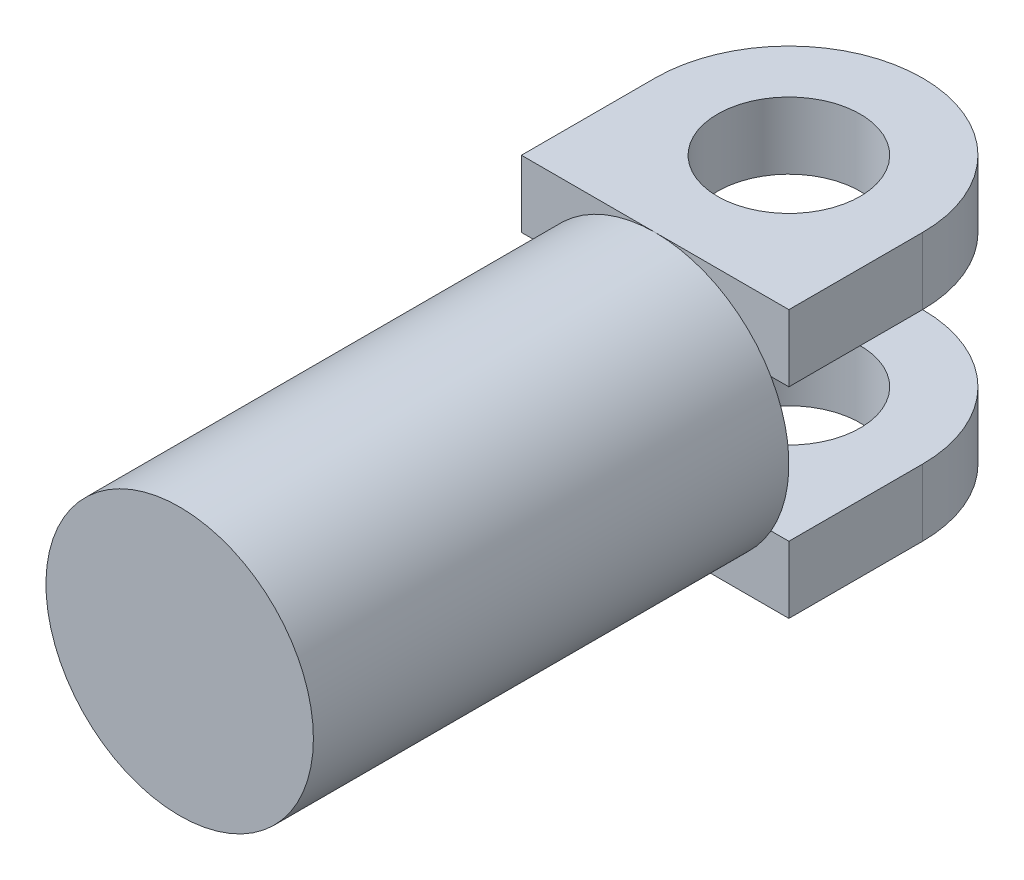
ISO-10303-21;
HEADER;
FILE_DESCRIPTION(('STEP AP214'),'2;1');
FILE_NAME('part.step','',(''),(''),'','','');
FILE_SCHEMA(('AUTOMOTIVE_DESIGN { 1 0 10303 214 1 1 1 1 }'));
ENDSEC;
DATA;
#1=APPLICATION_CONTEXT('core data for automotive mechanical design processes');
#2=APPLICATION_PROTOCOL_DEFINITION('international standard','automotive_design',2000,#1);
#3=PRODUCT_CONTEXT('',#1,'mechanical');
#4=PRODUCT('Part','Part','',(#3));
#5=PRODUCT_RELATED_PRODUCT_CATEGORY('part','',(#4));
#6=PRODUCT_DEFINITION_FORMATION('','',#4);
#7=PRODUCT_DEFINITION_CONTEXT('part definition',#1,'design');
#8=PRODUCT_DEFINITION('design','',#6,#7);
#9=PRODUCT_DEFINITION_SHAPE('','',#8);
#10=(LENGTH_UNIT() NAMED_UNIT(*) SI_UNIT(.MILLI.,.METRE.));
#11=(NAMED_UNIT(*) PLANE_ANGLE_UNIT() SI_UNIT($,.RADIAN.));
#12=(NAMED_UNIT(*) SI_UNIT($,.STERADIAN.) SOLID_ANGLE_UNIT());
#13=UNCERTAINTY_MEASURE_WITH_UNIT(LENGTH_MEASURE(1.E-05),#10,'distance_accuracy_value','');
#14=(GEOMETRIC_REPRESENTATION_CONTEXT(3) GLOBAL_UNCERTAINTY_ASSIGNED_CONTEXT((#13)) GLOBAL_UNIT_ASSIGNED_CONTEXT((#10,
#11,#12)) REPRESENTATION_CONTEXT('',''));
#15=CARTESIAN_POINT('',(0.,0.,0.));
#16=DIRECTION('',(0.,0.,1.));
#17=DIRECTION('',(1.,0.,0.));
#18=AXIS2_PLACEMENT_3D('',#15,#16,#17);
#19=CARTESIAN_POINT('',(0.,-90.,-90.));
#20=DIRECTION('',(0.,1.,0.));
#21=DIRECTION('',(0.,0.,1.));
#22=AXIS2_PLACEMENT_3D('',#19,#20,#21);
#23=CYLINDRICAL_SURFACE('',#22,90.);
#24=CARTESIAN_POINT('',(0.,-45.,-90.));
#25=DIRECTION('',(0.,-1.,0.));
#26=DIRECTION('',(0.,0.,-1.));
#27=AXIS2_PLACEMENT_3D('',#24,#25,#26);
#28=CIRCLE('',#27,90.);
#29=CARTESIAN_POINT('',(90.,-45.,-90.));
#30=VERTEX_POINT('',#29);
#31=CARTESIAN_POINT('',(-90.,-45.,-90.));
#32=VERTEX_POINT('',#31);
#33=EDGE_CURVE('E133',#30,#32,#28,.F.);
#34=ORIENTED_EDGE('',*,*,#33,.F.);
#35=DIRECTION('',(0.,1.,0.));
#36=VECTOR('',#35,1.);
#37=CARTESIAN_POINT('',(90.,-90.,-90.));
#38=LINE('',#37,#36);
#39=CARTESIAN_POINT('',(90.,-90.,-90.));
#40=VERTEX_POINT('',#39);
#41=EDGE_CURVE('E181',#40,#30,#38,.T.);
#42=ORIENTED_EDGE('',*,*,#41,.F.);
#43=CARTESIAN_POINT('',(0.,-90.,-90.));
#44=DIRECTION('',(0.,1.,0.));
#45=DIRECTION('',(0.,0.,1.));
#46=AXIS2_PLACEMENT_3D('',#43,#44,#45);
#47=CIRCLE('',#46,90.);
#48=CARTESIAN_POINT('',(-90.,-90.,-90.));
#49=VERTEX_POINT('',#48);
#50=EDGE_CURVE('E200',#40,#49,#47,.T.);
#51=ORIENTED_EDGE('',*,*,#50,.T.);
#52=DIRECTION('',(0.,1.,0.));
#53=VECTOR('',#52,1.);
#54=CARTESIAN_POINT('',(-90.,-90.,-90.));
#55=LINE('',#54,#53);
#56=EDGE_CURVE('E159',#49,#32,#55,.T.);
#57=ORIENTED_EDGE('',*,*,#56,.T.);
#58=EDGE_LOOP('',(#34,#42,#51,#57));
#59=FACE_BOUND('',#58,.T.);
#60=ADVANCED_FACE('F41',(#59),#23,.T.);
#61=CARTESIAN_POINT('',(90.,-90.,0.));
#62=DIRECTION('',(1.,0.,0.));
#63=DIRECTION('',(0.,0.,-1.));
#64=AXIS2_PLACEMENT_3D('',#61,#62,#63);
#65=PLANE('',#64);
#66=DIRECTION('',(0.,0.,-1.));
#67=VECTOR('',#66,1.);
#68=CARTESIAN_POINT('',(90.,-45.,0.));
#69=LINE('',#68,#67);
#70=CARTESIAN_POINT('',(90.,-45.,0.));
#71=VERTEX_POINT('',#70);
#72=EDGE_CURVE('E231',#71,#30,#69,.T.);
#73=ORIENTED_EDGE('',*,*,#72,.F.);
#74=DIRECTION('',(0.,1.,0.));
#75=VECTOR('',#74,1.);
#76=CARTESIAN_POINT('',(90.,-90.,0.));
#77=LINE('',#76,#75);
#78=CARTESIAN_POINT('',(90.,-90.,0.));
#79=VERTEX_POINT('',#78);
#80=EDGE_CURVE('E157',#79,#71,#77,.T.);
#81=ORIENTED_EDGE('',*,*,#80,.F.);
#82=DIRECTION('',(0.,0.,-1.));
#83=VECTOR('',#82,1.);
#84=CARTESIAN_POINT('',(90.,-90.,0.));
#85=LINE('',#84,#83);
#86=EDGE_CURVE('E190',#79,#40,#85,.T.);
#87=ORIENTED_EDGE('',*,*,#86,.T.);
#88=ORIENTED_EDGE('',*,*,#41,.T.);
#89=EDGE_LOOP('',(#73,#81,#87,#88));
#90=FACE_BOUND('',#89,.T.);
#91=ADVANCED_FACE('F303',(#90),#65,.T.);
#92=CARTESIAN_POINT('',(0.,-90.,-90.));
#93=DIRECTION('',(0.,1.,0.));
#94=DIRECTION('',(0.,0.,1.));
#95=AXIS2_PLACEMENT_3D('',#92,#93,#94);
#96=CYLINDRICAL_SURFACE('',#95,48.);
#97=CARTESIAN_POINT('',(0.,-45.,-90.));
#98=DIRECTION('',(0.,-1.,0.));
#99=DIRECTION('',(0.,0.,-1.));
#100=AXIS2_PLACEMENT_3D('',#97,#98,#99);
#101=CIRCLE('',#100,48.);
#102=CARTESIAN_POINT('',(0.,-45.,-42.));
#103=VERTEX_POINT('',#102);
#104=EDGE_CURVE('E234',#103,#103,#101,.F.);
#105=CARTESIAN_POINT('',(0.,-90.,-90.));
#106=DIRECTION('',(0.,1.,0.));
#107=DIRECTION('',(0.,0.,1.));
#108=AXIS2_PLACEMENT_3D('',#105,#106,#107);
#109=CIRCLE('',#108,48.);
#110=CARTESIAN_POINT('',(0.,-90.,-42.));
#111=VERTEX_POINT('',#110);
#112=EDGE_CURVE('E204',#111,#111,#109,.T.);
#113=CARTESIAN_POINT('',(0.,-45.,-42.));
#114=CARTESIAN_POINT('',(0.,-45.46875,-42.));
#115=CARTESIAN_POINT('',(0.,-45.9375,-42.));
#116=CARTESIAN_POINT('',(0.,-46.875,-42.));
#117=CARTESIAN_POINT('',(0.,-47.34375,-42.));
#118=CARTESIAN_POINT('',(0.,-48.28125,-42.));
#119=CARTESIAN_POINT('',(0.,-48.75,-42.));
#120=CARTESIAN_POINT('',(0.,-49.6875,-42.));
#121=CARTESIAN_POINT('',(0.,-50.15625,-42.));
#122=CARTESIAN_POINT('',(0.,-51.09375,-42.));
#123=CARTESIAN_POINT('',(0.,-51.5625,-42.));
#124=CARTESIAN_POINT('',(0.,-52.5,-42.));
#125=CARTESIAN_POINT('',(0.,-52.96875,-42.));
#126=CARTESIAN_POINT('',(0.,-53.90625,-42.));
#127=CARTESIAN_POINT('',(0.,-54.375,-42.));
#128=CARTESIAN_POINT('',(0.,-55.3125,-42.));
#129=CARTESIAN_POINT('',(0.,-55.78125,-42.));
#130=CARTESIAN_POINT('',(0.,-56.71875,-42.));
#131=CARTESIAN_POINT('',(0.,-57.1875,-42.));
#132=CARTESIAN_POINT('',(0.,-58.125,-42.));
#133=CARTESIAN_POINT('',(0.,-58.59375,-42.));
#134=CARTESIAN_POINT('',(0.,-59.53125,-42.));
#135=CARTESIAN_POINT('',(0.,-60.,-42.));
#136=CARTESIAN_POINT('',(0.,-60.9375,-42.));
#137=CARTESIAN_POINT('',(0.,-61.40625,-42.));
#138=CARTESIAN_POINT('',(0.,-62.34375,-42.));
#139=CARTESIAN_POINT('',(0.,-62.8125,-42.));
#140=CARTESIAN_POINT('',(0.,-63.75,-42.));
#141=CARTESIAN_POINT('',(0.,-64.21875,-42.));
#142=CARTESIAN_POINT('',(0.,-65.15625,-42.));
#143=CARTESIAN_POINT('',(0.,-65.625,-42.));
#144=CARTESIAN_POINT('',(0.,-66.5625,-42.));
#145=CARTESIAN_POINT('',(0.,-67.03125,-42.));
#146=CARTESIAN_POINT('',(0.,-67.96875,-42.));
#147=CARTESIAN_POINT('',(0.,-68.4375,-42.));
#148=CARTESIAN_POINT('',(0.,-69.375,-42.));
#149=CARTESIAN_POINT('',(0.,-69.84375,-42.));
#150=CARTESIAN_POINT('',(0.,-70.78125,-42.));
#151=CARTESIAN_POINT('',(0.,-71.25,-42.));
#152=CARTESIAN_POINT('',(0.,-72.1875,-42.));
#153=CARTESIAN_POINT('',(0.,-72.65625,-42.));
#154=CARTESIAN_POINT('',(0.,-73.59375,-42.));
#155=CARTESIAN_POINT('',(0.,-74.0625,-42.));
#156=CARTESIAN_POINT('',(0.,-75.,-42.));
#157=CARTESIAN_POINT('',(0.,-75.46875,-42.));
#158=CARTESIAN_POINT('',(0.,-76.40625,-42.));
#159=CARTESIAN_POINT('',(0.,-76.875,-42.));
#160=CARTESIAN_POINT('',(0.,-77.8125,-42.));
#161=CARTESIAN_POINT('',(0.,-78.28125,-42.));
#162=CARTESIAN_POINT('',(0.,-79.21875,-42.));
#163=CARTESIAN_POINT('',(0.,-79.6875,-42.));
#164=CARTESIAN_POINT('',(0.,-80.625,-42.));
#165=CARTESIAN_POINT('',(0.,-81.09375,-42.));
#166=CARTESIAN_POINT('',(0.,-82.03125,-42.));
#167=CARTESIAN_POINT('',(0.,-82.5,-42.));
#168=CARTESIAN_POINT('',(0.,-83.4375,-42.));
#169=CARTESIAN_POINT('',(0.,-83.90625,-42.));
#170=CARTESIAN_POINT('',(0.,-84.84375,-42.));
#171=CARTESIAN_POINT('',(0.,-85.3125,-42.));
#172=CARTESIAN_POINT('',(0.,-86.25,-42.));
#173=CARTESIAN_POINT('',(0.,-86.71875,-42.));
#174=CARTESIAN_POINT('',(0.,-87.65625,-42.));
#175=CARTESIAN_POINT('',(0.,-88.125,-42.));
#176=CARTESIAN_POINT('',(0.,-89.0625,-42.));
#177=CARTESIAN_POINT('',(0.,-89.53125,-42.));
#178=CARTESIAN_POINT('',(0.,-90.,-42.));
#179=B_SPLINE_CURVE_WITH_KNOTS('',3,(#113,#114,#115,#116,#117,#118,#119,#120,#121,#122,#123,
#124,#125,#126,#127,#128,#129,#130,#131,#132,#133,#134,#135,#136,#137,#138,#139,#140,#141,#142,
#143,#144,#145,#146,#147,#148,#149,#150,#151,#152,#153,#154,#155,#156,#157,#158,#159,#160,#161,
#162,#163,#164,#165,#166,#167,#168,#169,#170,#171,#172,#173,#174,#175,#176,#177,#178),
.UNSPECIFIED.,.F.,.F.,(4,2,2,2,2,2,2,2,2,2,2,2,2,2,2,2,2,2,2,2,2,2,2,2,2,2,2,2,2,2,2,2,4),(0.,
1.40625,2.8125,4.21875,5.625,7.03125,8.4375,9.84375,11.25,12.65625,14.0625,15.46875,16.875,
18.28125,19.6875,21.09375,22.5,23.90625,25.3125,26.71875,28.125,29.53125,30.9375,32.34375,33.75,
35.15625,36.5625,37.96875,39.375,40.78125,42.1875,43.59375,45.),.UNSPECIFIED.);
#180=EDGE_CURVE('BSEAM299',#103,#111,#179,.T.);
#181=ORIENTED_EDGE('',*,*,#104,.T.);
#182=ORIENTED_EDGE('',*,*,#112,.F.);
#183=ORIENTED_EDGE('',*,*,#180,.T.);
#184=ORIENTED_EDGE('',*,*,#180,.F.);
#185=EDGE_LOOP('',(#181,#183,#182,#184));
#186=FACE_BOUND('',#185,.T.);
#187=ADVANCED_FACE('F299',(#186),#96,.F.);
#188=CARTESIAN_POINT('',(-90.,-90.,0.));
#189=DIRECTION('',(-1.,0.,0.));
#190=DIRECTION('',(0.,0.,1.));
#191=AXIS2_PLACEMENT_3D('',#188,#189,#190);
#192=PLANE('',#191);
#193=DIRECTION('',(0.,0.,1.));
#194=VECTOR('',#193,1.);
#195=CARTESIAN_POINT('',(-90.,-45.,0.));
#196=LINE('',#195,#194);
#197=CARTESIAN_POINT('',(-90.,-45.,0.));
#198=VERTEX_POINT('',#197);
#199=EDGE_CURVE('E11',#32,#198,#196,.T.);
#200=ORIENTED_EDGE('',*,*,#199,.F.);
#201=ORIENTED_EDGE('',*,*,#56,.F.);
#202=DIRECTION('',(0.,0.,1.));
#203=VECTOR('',#202,1.);
#204=CARTESIAN_POINT('',(-90.,-90.,0.));
#205=LINE('',#204,#203);
#206=CARTESIAN_POINT('',(-90.,-90.,0.));
#207=VERTEX_POINT('',#206);
#208=EDGE_CURVE('E150',#49,#207,#205,.T.);
#209=ORIENTED_EDGE('',*,*,#208,.T.);
#210=DIRECTION('',(0.,1.,0.));
#211=VECTOR('',#210,1.);
#212=CARTESIAN_POINT('',(-90.,-90.,0.));
#213=LINE('',#212,#211);
#214=EDGE_CURVE('E141',#207,#198,#213,.T.);
#215=ORIENTED_EDGE('',*,*,#214,.T.);
#216=EDGE_LOOP('',(#200,#201,#209,#215));
#217=FACE_BOUND('',#216,.T.);
#218=ADVANCED_FACE('F148',(#217),#192,.T.);
#219=CARTESIAN_POINT('',(0.,0.,320.));
#220=DIRECTION('',(0.,0.,-1.));
#221=DIRECTION('',(-1.,0.,0.));
#222=AXIS2_PLACEMENT_3D('',#219,#220,#221);
#223=CYLINDRICAL_SURFACE('',#222,90.);
#224=CARTESIAN_POINT('',(0.,0.,320.));
#225=DIRECTION('',(0.,0.,1.));
#226=DIRECTION('',(1.,0.,0.));
#227=AXIS2_PLACEMENT_3D('',#224,#225,#226);
#228=CIRCLE('',#227,90.);
#229=CARTESIAN_POINT('',(90.,0.,320.));
#230=VERTEX_POINT('',#229);
#231=EDGE_CURVE('E50',#230,#230,#228,.T.);
#232=ORIENTED_EDGE('',*,*,#231,.F.);
#233=EDGE_LOOP('',(#232));
#234=FACE_BOUND('',#233,.T.);
#235=CARTESIAN_POINT('',(0.,0.,0.));
#236=DIRECTION('',(0.,0.,1.));
#237=DIRECTION('',(1.,0.,0.));
#238=AXIS2_PLACEMENT_3D('',#235,#236,#237);
#239=CIRCLE('',#238,90.);
#240=CARTESIAN_POINT('',(77.9422863405995,-45.,0.));
#241=VERTEX_POINT('',#240);
#242=CARTESIAN_POINT('',(77.9422863405995,45.,0.));
#243=VERTEX_POINT('',#242);
#244=EDGE_CURVE('E167',#241,#243,#239,.T.);
#245=ORIENTED_EDGE('',*,*,#244,.T.);
#246=CARTESIAN_POINT('',(0.,90.,0.));
#247=VERTEX_POINT('',#246);
#248=EDGE_CURVE('E170',#243,#247,#239,.T.);
#249=ORIENTED_EDGE('',*,*,#248,.T.);
#250=CARTESIAN_POINT('',(-77.9422863405995,45.,0.));
#251=VERTEX_POINT('',#250);
#252=EDGE_CURVE('E171',#247,#251,#239,.T.);
#253=ORIENTED_EDGE('',*,*,#252,.T.);
#254=CARTESIAN_POINT('',(-77.9422863405995,-45.,0.));
#255=VERTEX_POINT('',#254);
#256=EDGE_CURVE('E175',#251,#255,#239,.T.);
#257=ORIENTED_EDGE('',*,*,#256,.T.);
#258=CARTESIAN_POINT('',(0.,-90.,0.));
#259=VERTEX_POINT('',#258);
#260=EDGE_CURVE('E65',#255,#259,#239,.T.);
#261=ORIENTED_EDGE('',*,*,#260,.T.);
#262=EDGE_CURVE('E178',#259,#241,#239,.T.);
#263=ORIENTED_EDGE('',*,*,#262,.T.);
#264=EDGE_LOOP('',(#245,#249,#253,#257,#261,#263));
#265=FACE_BOUND('',#264,.T.);
#266=ADVANCED_FACE('F43',(#234,#265),#223,.T.);
#267=CARTESIAN_POINT('',(0.,0.,320.));
#268=DIRECTION('',(0.,0.,1.));
#269=DIRECTION('',(1.,0.,0.));
#270=AXIS2_PLACEMENT_3D('',#267,#268,#269);
#271=PLANE('',#270);
#272=ORIENTED_EDGE('',*,*,#231,.T.);
#273=EDGE_LOOP('',(#272));
#274=FACE_BOUND('',#273,.T.);
#275=ADVANCED_FACE('F292',(#274),#271,.T.);
#276=CARTESIAN_POINT('',(0.,-90.,0.));
#277=DIRECTION('',(0.,0.,-1.));
#278=DIRECTION('',(-1.,0.,0.));
#279=AXIS2_PLACEMENT_3D('',#276,#277,#278);
#280=PLANE('',#279);
#281=ORIENTED_EDGE('',*,*,#248,.F.);
#282=DIRECTION('',(-1.,0.,0.));
#283=VECTOR('',#282,1.);
#284=CARTESIAN_POINT('',(573.,45.,0.));
#285=LINE('',#284,#283);
#286=CARTESIAN_POINT('',(90.,45.,0.));
#287=VERTEX_POINT('',#286);
#288=EDGE_CURVE('E145',#287,#243,#285,.T.);
#289=ORIENTED_EDGE('',*,*,#288,.F.);
#290=CARTESIAN_POINT('',(90.,90.,0.));
#291=VERTEX_POINT('',#290);
#292=EDGE_CURVE('E152',#287,#291,#77,.T.);
#293=ORIENTED_EDGE('',*,*,#292,.T.);
#294=DIRECTION('',(-1.,0.,0.));
#295=VECTOR('',#294,1.);
#296=CARTESIAN_POINT('',(0.,90.,0.));
#297=LINE('',#296,#295);
#298=EDGE_CURVE('E212',#291,#247,#297,.T.);
#299=ORIENTED_EDGE('',*,*,#298,.T.);
#300=EDGE_LOOP('',(#281,#289,#293,#299));
#301=FACE_BOUND('',#300,.T.);
#302=ADVANCED_FACE('F290',(#301),#280,.F.);
#303=CARTESIAN_POINT('',(-90.,45.,0.));
#304=VERTEX_POINT('',#303);
#305=CARTESIAN_POINT('',(-90.,90.,0.));
#306=VERTEX_POINT('',#305);
#307=EDGE_CURVE('E153',#304,#306,#213,.T.);
#308=ORIENTED_EDGE('',*,*,#307,.F.);
#309=EDGE_CURVE('E57',#251,#304,#285,.T.);
#310=ORIENTED_EDGE('',*,*,#309,.F.);
#311=ORIENTED_EDGE('',*,*,#252,.F.);
#312=EDGE_CURVE('E216',#247,#306,#297,.T.);
#313=ORIENTED_EDGE('',*,*,#312,.T.);
#314=EDGE_LOOP('',(#308,#310,#311,#313));
#315=FACE_BOUND('',#314,.T.);
#316=ADVANCED_FACE('F280',(#315),#280,.F.);
#317=ORIENTED_EDGE('',*,*,#260,.F.);
#318=DIRECTION('',(-1.,0.,0.));
#319=VECTOR('',#318,1.);
#320=CARTESIAN_POINT('',(573.,-45.,0.));
#321=LINE('',#320,#319);
#322=EDGE_CURVE('E130',#255,#198,#321,.T.);
#323=ORIENTED_EDGE('',*,*,#322,.T.);
#324=ORIENTED_EDGE('',*,*,#214,.F.);
#325=DIRECTION('',(-1.,0.,0.));
#326=VECTOR('',#325,1.);
#327=CARTESIAN_POINT('',(0.,-90.,0.));
#328=LINE('',#327,#326);
#329=EDGE_CURVE('E197',#259,#207,#328,.T.);
#330=ORIENTED_EDGE('',*,*,#329,.F.);
#331=EDGE_LOOP('',(#317,#323,#324,#330));
#332=FACE_BOUND('',#331,.T.);
#333=ADVANCED_FACE('F139',(#332),#280,.F.);
#334=CARTESIAN_POINT('',(0.,45.,-90.));
#335=DIRECTION('',(0.,1.,0.));
#336=DIRECTION('',(0.,0.,1.));
#337=AXIS2_PLACEMENT_3D('',#334,#335,#336);
#338=CIRCLE('',#337,90.);
#339=CARTESIAN_POINT('',(-90.,45.,-90.));
#340=VERTEX_POINT('',#339);
#341=CARTESIAN_POINT('',(90.,45.,-90.));
#342=VERTEX_POINT('',#341);
#343=EDGE_CURVE('E238',#340,#342,#338,.F.);
#344=ORIENTED_EDGE('',*,*,#343,.F.);
#345=CARTESIAN_POINT('',(-90.,90.,-90.));
#346=VERTEX_POINT('',#345);
#347=EDGE_CURVE('E164',#340,#346,#55,.T.);
#348=ORIENTED_EDGE('',*,*,#347,.T.);
#349=CARTESIAN_POINT('',(0.,90.,-90.));
#350=DIRECTION('',(0.,1.,0.));
#351=DIRECTION('',(0.,0.,1.));
#352=AXIS2_PLACEMENT_3D('',#349,#350,#351);
#353=CIRCLE('',#352,90.);
#354=CARTESIAN_POINT('',(90.,90.,-90.));
#355=VERTEX_POINT('',#354);
#356=EDGE_CURVE('E221',#355,#346,#353,.T.);
#357=ORIENTED_EDGE('',*,*,#356,.F.);
#358=EDGE_CURVE('E184',#342,#355,#38,.T.);
#359=ORIENTED_EDGE('',*,*,#358,.F.);
#360=EDGE_LOOP('',(#344,#348,#357,#359));
#361=FACE_BOUND('',#360,.T.);
#362=ADVANCED_FACE('F262',(#361),#23,.T.);
#363=DIRECTION('',(0.,0.,1.));
#364=VECTOR('',#363,1.);
#365=CARTESIAN_POINT('',(90.,45.,0.));
#366=LINE('',#365,#364);
#367=EDGE_CURVE('E241',#342,#287,#366,.T.);
#368=ORIENTED_EDGE('',*,*,#367,.F.);
#369=ORIENTED_EDGE('',*,*,#358,.T.);
#370=DIRECTION('',(0.,0.,-1.));
#371=VECTOR('',#370,1.);
#372=CARTESIAN_POINT('',(90.,90.,0.));
#373=LINE('',#372,#371);
#374=EDGE_CURVE('E208',#291,#355,#373,.T.);
#375=ORIENTED_EDGE('',*,*,#374,.F.);
#376=ORIENTED_EDGE('',*,*,#292,.F.);
#377=EDGE_LOOP('',(#368,#369,#375,#376));
#378=FACE_BOUND('',#377,.T.);
#379=ADVANCED_FACE('F288',(#378),#65,.T.);
#380=ORIENTED_EDGE('',*,*,#80,.T.);
#381=EDGE_CURVE('E147',#71,#241,#321,.T.);
#382=ORIENTED_EDGE('',*,*,#381,.T.);
#383=ORIENTED_EDGE('',*,*,#262,.F.);
#384=EDGE_CURVE('E193',#79,#259,#328,.T.);
#385=ORIENTED_EDGE('',*,*,#384,.F.);
#386=EDGE_LOOP('',(#380,#382,#383,#385));
#387=FACE_BOUND('',#386,.T.);
#388=ADVANCED_FACE('F316',(#387),#280,.F.);
#389=CARTESIAN_POINT('',(0.,45.,-90.));
#390=DIRECTION('',(0.,1.,0.));
#391=DIRECTION('',(0.,0.,1.));
#392=AXIS2_PLACEMENT_3D('',#389,#390,#391);
#393=CIRCLE('',#392,48.);
#394=CARTESIAN_POINT('',(0.,45.,-42.));
#395=VERTEX_POINT('',#394);
#396=EDGE_CURVE('E244',#395,#395,#393,.F.);
#397=CARTESIAN_POINT('',(0.,90.,-90.));
#398=DIRECTION('',(0.,1.,0.));
#399=DIRECTION('',(0.,0.,1.));
#400=AXIS2_PLACEMENT_3D('',#397,#398,#399);
#401=CIRCLE('',#400,48.);
#402=CARTESIAN_POINT('',(0.,90.,-42.));
#403=VERTEX_POINT('',#402);
#404=EDGE_CURVE('E225',#403,#403,#401,.T.);
#405=CARTESIAN_POINT('',(0.,45.,-42.));
#406=CARTESIAN_POINT('',(0.,45.46875,-42.));
#407=CARTESIAN_POINT('',(0.,45.9375,-42.));
#408=CARTESIAN_POINT('',(0.,46.875,-42.));
#409=CARTESIAN_POINT('',(0.,47.34375,-42.));
#410=CARTESIAN_POINT('',(0.,48.28125,-42.));
#411=CARTESIAN_POINT('',(0.,48.75,-42.));
#412=CARTESIAN_POINT('',(0.,49.6875,-42.));
#413=CARTESIAN_POINT('',(0.,50.15625,-42.));
#414=CARTESIAN_POINT('',(0.,51.09375,-42.));
#415=CARTESIAN_POINT('',(0.,51.5625,-42.));
#416=CARTESIAN_POINT('',(0.,52.5,-42.));
#417=CARTESIAN_POINT('',(0.,52.96875,-42.));
#418=CARTESIAN_POINT('',(0.,53.90625,-42.));
#419=CARTESIAN_POINT('',(0.,54.375,-42.));
#420=CARTESIAN_POINT('',(0.,55.3125,-42.));
#421=CARTESIAN_POINT('',(0.,55.78125,-42.));
#422=CARTESIAN_POINT('',(0.,56.71875,-42.));
#423=CARTESIAN_POINT('',(0.,57.1875,-42.));
#424=CARTESIAN_POINT('',(0.,58.125,-42.));
#425=CARTESIAN_POINT('',(0.,58.59375,-42.));
#426=CARTESIAN_POINT('',(0.,59.53125,-42.));
#427=CARTESIAN_POINT('',(0.,60.,-42.));
#428=CARTESIAN_POINT('',(0.,60.9375,-42.));
#429=CARTESIAN_POINT('',(0.,61.40625,-42.));
#430=CARTESIAN_POINT('',(0.,62.34375,-42.));
#431=CARTESIAN_POINT('',(0.,62.8125,-42.));
#432=CARTESIAN_POINT('',(0.,63.75,-42.));
#433=CARTESIAN_POINT('',(0.,64.21875,-42.));
#434=CARTESIAN_POINT('',(0.,65.15625,-42.));
#435=CARTESIAN_POINT('',(0.,65.625,-42.));
#436=CARTESIAN_POINT('',(0.,66.5625,-42.));
#437=CARTESIAN_POINT('',(0.,67.03125,-42.));
#438=CARTESIAN_POINT('',(0.,67.96875,-42.));
#439=CARTESIAN_POINT('',(0.,68.4375,-42.));
#440=CARTESIAN_POINT('',(0.,69.375,-42.));
#441=CARTESIAN_POINT('',(0.,69.84375,-42.));
#442=CARTESIAN_POINT('',(0.,70.78125,-42.));
#443=CARTESIAN_POINT('',(0.,71.25,-42.));
#444=CARTESIAN_POINT('',(0.,72.1875,-42.));
#445=CARTESIAN_POINT('',(0.,72.65625,-42.));
#446=CARTESIAN_POINT('',(0.,73.59375,-42.));
#447=CARTESIAN_POINT('',(0.,74.0625,-42.));
#448=CARTESIAN_POINT('',(0.,75.,-42.));
#449=CARTESIAN_POINT('',(0.,75.46875,-42.));
#450=CARTESIAN_POINT('',(0.,76.40625,-42.));
#451=CARTESIAN_POINT('',(0.,76.875,-42.));
#452=CARTESIAN_POINT('',(0.,77.8125,-42.));
#453=CARTESIAN_POINT('',(0.,78.28125,-42.));
#454=CARTESIAN_POINT('',(0.,79.21875,-42.));
#455=CARTESIAN_POINT('',(0.,79.6875,-42.));
#456=CARTESIAN_POINT('',(0.,80.625,-42.));
#457=CARTESIAN_POINT('',(0.,81.09375,-42.));
#458=CARTESIAN_POINT('',(0.,82.03125,-42.));
#459=CARTESIAN_POINT('',(0.,82.5,-42.));
#460=CARTESIAN_POINT('',(0.,83.4375,-42.));
#461=CARTESIAN_POINT('',(0.,83.90625,-42.));
#462=CARTESIAN_POINT('',(0.,84.84375,-42.));
#463=CARTESIAN_POINT('',(0.,85.3125,-42.));
#464=CARTESIAN_POINT('',(0.,86.25,-42.));
#465=CARTESIAN_POINT('',(0.,86.71875,-42.));
#466=CARTESIAN_POINT('',(0.,87.65625,-42.));
#467=CARTESIAN_POINT('',(0.,88.125,-42.));
#468=CARTESIAN_POINT('',(0.,89.0625,-42.));
#469=CARTESIAN_POINT('',(0.,89.53125,-42.));
#470=CARTESIAN_POINT('',(0.,90.,-42.));
#471=B_SPLINE_CURVE_WITH_KNOTS('',3,(#405,#406,#407,#408,#409,#410,#411,#412,#413,#414,#415,
#416,#417,#418,#419,#420,#421,#422,#423,#424,#425,#426,#427,#428,#429,#430,#431,#432,#433,#434,
#435,#436,#437,#438,#439,#440,#441,#442,#443,#444,#445,#446,#447,#448,#449,#450,#451,#452,#453,
#454,#455,#456,#457,#458,#459,#460,#461,#462,#463,#464,#465,#466,#467,#468,#469,#470),
.UNSPECIFIED.,.F.,.F.,(4,2,2,2,2,2,2,2,2,2,2,2,2,2,2,2,2,2,2,2,2,2,2,2,2,2,2,2,2,2,2,2,4),(0.,
1.40625,2.8125,4.21874999999999,5.62499999999999,7.03124999999999,8.43749999999999,
9.84374999999998,11.25,12.65625,14.0625,15.46875,16.875,18.28125,19.6875,21.09375,22.5,23.90625,
25.3125,26.71875,28.125,29.53125,30.9375,32.34375,33.7499999999999,35.1562499999999,
36.5624999999999,37.9687499999999,39.3749999999999,40.7812499999999,42.1874999999999,
43.5937499999999,44.9999999999999),.UNSPECIFIED.);
#472=EDGE_CURVE('BSEAM322',#395,#403,#471,.T.);
#473=ORIENTED_EDGE('',*,*,#396,.T.);
#474=ORIENTED_EDGE('',*,*,#404,.T.);
#475=ORIENTED_EDGE('',*,*,#472,.T.);
#476=ORIENTED_EDGE('',*,*,#472,.F.);
#477=EDGE_LOOP('',(#473,#475,#474,#476));
#478=FACE_BOUND('',#477,.T.);
#479=ADVANCED_FACE('F322',(#478),#96,.F.);
#480=DIRECTION('',(0.,0.,-1.));
#481=VECTOR('',#480,1.);
#482=CARTESIAN_POINT('',(-90.,45.,0.));
#483=LINE('',#482,#481);
#484=EDGE_CURVE('E250',#304,#340,#483,.T.);
#485=ORIENTED_EDGE('',*,*,#484,.F.);
#486=ORIENTED_EDGE('',*,*,#307,.T.);
#487=DIRECTION('',(0.,0.,1.));
#488=VECTOR('',#487,1.);
#489=CARTESIAN_POINT('',(-90.,90.,0.));
#490=LINE('',#489,#488);
#491=EDGE_CURVE('E217',#346,#306,#490,.T.);
#492=ORIENTED_EDGE('',*,*,#491,.F.);
#493=ORIENTED_EDGE('',*,*,#347,.F.);
#494=EDGE_LOOP('',(#485,#486,#492,#493));
#495=FACE_BOUND('',#494,.T.);
#496=ADVANCED_FACE('F265',(#495),#192,.T.);
#497=CARTESIAN_POINT('',(0.,-90.,0.));
#498=DIRECTION('',(0.,1.,0.));
#499=DIRECTION('',(0.,0.,1.));
#500=AXIS2_PLACEMENT_3D('',#497,#498,#499);
#501=PLANE('',#500);
#502=ORIENTED_EDGE('',*,*,#112,.T.);
#503=EDGE_LOOP('',(#502));
#504=FACE_BOUND('',#503,.T.);
#505=ORIENTED_EDGE('',*,*,#50,.F.);
#506=ORIENTED_EDGE('',*,*,#86,.F.);
#507=ORIENTED_EDGE('',*,*,#384,.T.);
#508=ORIENTED_EDGE('',*,*,#329,.T.);
#509=ORIENTED_EDGE('',*,*,#208,.F.);
#510=EDGE_LOOP('',(#505,#506,#507,#508,#509));
#511=FACE_BOUND('',#510,.T.);
#512=ADVANCED_FACE('F371',(#504,#511),#501,.F.);
#513=CARTESIAN_POINT('',(0.,90.,0.));
#514=DIRECTION('',(0.,1.,0.));
#515=DIRECTION('',(0.,0.,1.));
#516=AXIS2_PLACEMENT_3D('',#513,#514,#515);
#517=PLANE('',#516);
#518=ORIENTED_EDGE('',*,*,#404,.F.);
#519=EDGE_LOOP('',(#518));
#520=FACE_BOUND('',#519,.T.);
#521=ORIENTED_EDGE('',*,*,#356,.T.);
#522=ORIENTED_EDGE('',*,*,#491,.T.);
#523=ORIENTED_EDGE('',*,*,#312,.F.);
#524=ORIENTED_EDGE('',*,*,#298,.F.);
#525=ORIENTED_EDGE('',*,*,#374,.T.);
#526=EDGE_LOOP('',(#521,#522,#523,#524,#525));
#527=FACE_BOUND('',#526,.T.);
#528=ADVANCED_FACE('F284',(#520,#527),#517,.T.);
#529=CARTESIAN_POINT('',(573.,-45.,0.));
#530=DIRECTION('',(0.,0.,1.));
#531=DIRECTION('',(1.,0.,0.));
#532=AXIS2_PLACEMENT_3D('',#529,#530,#531);
#533=PLANE('',#532);
#534=EDGE_CURVE('E249',#243,#251,#285,.T.);
#535=ORIENTED_EDGE('',*,*,#534,.F.);
#536=ORIENTED_EDGE('',*,*,#244,.F.);
#537=EDGE_CURVE('E144',#241,#255,#321,.T.);
#538=ORIENTED_EDGE('',*,*,#537,.T.);
#539=ORIENTED_EDGE('',*,*,#256,.F.);
#540=EDGE_LOOP('',(#535,#536,#538,#539));
#541=FACE_BOUND('',#540,.T.);
#542=ADVANCED_FACE('F377',(#541),#533,.F.);
#543=CARTESIAN_POINT('',(573.,-45.,0.));
#544=DIRECTION('',(0.,-1.,0.));
#545=DIRECTION('',(0.,0.,-1.));
#546=AXIS2_PLACEMENT_3D('',#543,#544,#545);
#547=PLANE('',#546);
#548=ORIENTED_EDGE('',*,*,#33,.T.);
#549=ORIENTED_EDGE('',*,*,#199,.T.);
#550=ORIENTED_EDGE('',*,*,#322,.F.);
#551=ORIENTED_EDGE('',*,*,#537,.F.);
#552=ORIENTED_EDGE('',*,*,#381,.F.);
#553=ORIENTED_EDGE('',*,*,#72,.T.);
#554=EDGE_LOOP('',(#548,#549,#550,#551,#552,#553));
#555=FACE_BOUND('',#554,.T.);
#556=ORIENTED_EDGE('',*,*,#104,.F.);
#557=EDGE_LOOP('',(#556));
#558=FACE_BOUND('',#557,.T.);
#559=ADVANCED_FACE('F127',(#555,#558),#547,.F.);
#560=CARTESIAN_POINT('',(573.,45.,0.));
#561=DIRECTION('',(0.,1.,0.));
#562=DIRECTION('',(0.,0.,1.));
#563=AXIS2_PLACEMENT_3D('',#560,#561,#562);
#564=PLANE('',#563);
#565=ORIENTED_EDGE('',*,*,#343,.T.);
#566=ORIENTED_EDGE('',*,*,#367,.T.);
#567=ORIENTED_EDGE('',*,*,#288,.T.);
#568=ORIENTED_EDGE('',*,*,#534,.T.);
#569=ORIENTED_EDGE('',*,*,#309,.T.);
#570=ORIENTED_EDGE('',*,*,#484,.T.);
#571=EDGE_LOOP('',(#565,#566,#567,#568,#569,#570));
#572=FACE_BOUND('',#571,.T.);
#573=ORIENTED_EDGE('',*,*,#396,.F.);
#574=EDGE_LOOP('',(#573));
#575=FACE_BOUND('',#574,.T.);
#576=ADVANCED_FACE('F254',(#572,#575),#564,.F.);
#577=CLOSED_SHELL('',(#60,#91,#187,#218,#266,#275,#302,#316,#333,#362,#379,#388,#479,#496,#512,
#528,#542,#559,#576));
#578=MANIFOLD_SOLID_BREP('B2',#577);
#579=ADVANCED_BREP_SHAPE_REPRESENTATION('',(#18,#578),#14);
#580=SHAPE_DEFINITION_REPRESENTATION(#9,#579);
ENDSEC;
END-ISO-10303-21;
